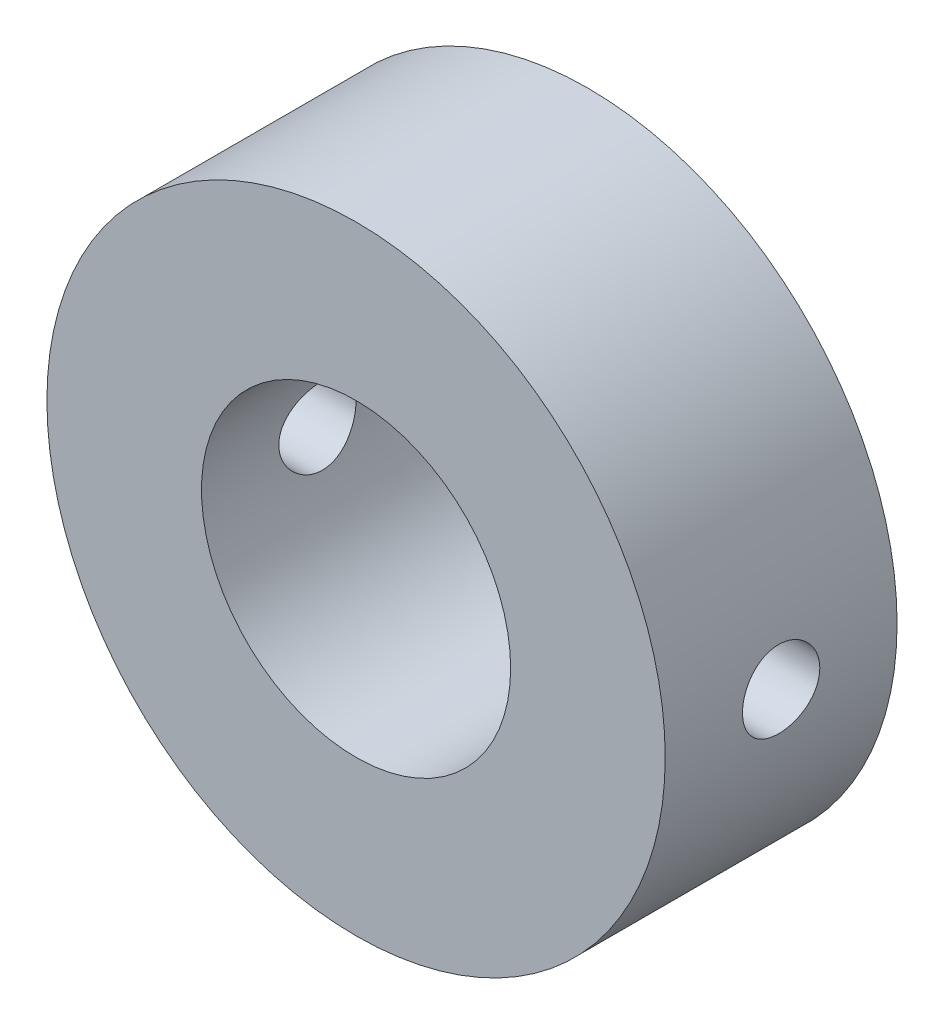
ISO-10303-21;
HEADER;
FILE_DESCRIPTION(('STEP AP214'),'2;1');
FILE_NAME('part.step','',(''),(''),'','','');
FILE_SCHEMA(('AUTOMOTIVE_DESIGN { 1 0 10303 214 1 1 1 1 }'));
ENDSEC;
DATA;
#1=APPLICATION_CONTEXT('core data for automotive mechanical design processes');
#2=APPLICATION_PROTOCOL_DEFINITION('international standard','automotive_design',2000,#1);
#3=PRODUCT_CONTEXT('',#1,'mechanical');
#4=PRODUCT('Part','Part','',(#3));
#5=PRODUCT_RELATED_PRODUCT_CATEGORY('part','',(#4));
#6=PRODUCT_DEFINITION_FORMATION('','',#4);
#7=PRODUCT_DEFINITION_CONTEXT('part definition',#1,'design');
#8=PRODUCT_DEFINITION('design','',#6,#7);
#9=PRODUCT_DEFINITION_SHAPE('','',#8);
#10=(LENGTH_UNIT() NAMED_UNIT(*) SI_UNIT(.MILLI.,.METRE.));
#11=(NAMED_UNIT(*) PLANE_ANGLE_UNIT() SI_UNIT($,.RADIAN.));
#12=(NAMED_UNIT(*) SI_UNIT($,.STERADIAN.) SOLID_ANGLE_UNIT());
#13=UNCERTAINTY_MEASURE_WITH_UNIT(LENGTH_MEASURE(1.E-05),#10,'distance_accuracy_value','');
#14=(GEOMETRIC_REPRESENTATION_CONTEXT(3) GLOBAL_UNCERTAINTY_ASSIGNED_CONTEXT((#13)) GLOBAL_UNIT_ASSIGNED_CONTEXT((#10,
#11,#12)) REPRESENTATION_CONTEXT('',''));
#15=CARTESIAN_POINT('',(0.,0.,0.));
#16=DIRECTION('',(0.,0.,1.));
#17=DIRECTION('',(1.,0.,0.));
#18=AXIS2_PLACEMENT_3D('',#15,#16,#17);
#19=CARTESIAN_POINT('',(0.,0.,6.));
#20=DIRECTION('',(0.,0.,1.));
#21=DIRECTION('',(1.,0.,0.));
#22=AXIS2_PLACEMENT_3D('',#19,#20,#21);
#23=PLANE('',#22);
#24=CARTESIAN_POINT('',(0.,0.,6.));
#25=DIRECTION('',(0.,0.,1.));
#26=DIRECTION('',(1.,0.,0.));
#27=AXIS2_PLACEMENT_3D('',#24,#25,#26);
#28=CIRCLE('',#27,8.);
#29=CARTESIAN_POINT('',(8.,0.,6.));
#30=VERTEX_POINT('',#29);
#31=EDGE_CURVE('E59',#30,#30,#28,.T.);
#32=ORIENTED_EDGE('',*,*,#31,.T.);
#33=EDGE_LOOP('',(#32));
#34=FACE_BOUND('',#33,.T.);
#35=CARTESIAN_POINT('',(0.,0.,6.));
#36=DIRECTION('',(0.,0.,1.));
#37=DIRECTION('',(1.,0.,0.));
#38=AXIS2_PLACEMENT_3D('',#35,#36,#37);
#39=CIRCLE('',#38,4.);
#40=CARTESIAN_POINT('',(4.,0.,6.));
#41=VERTEX_POINT('',#40);
#42=EDGE_CURVE('E95',#41,#41,#39,.T.);
#43=ORIENTED_EDGE('',*,*,#42,.F.);
#44=EDGE_LOOP('',(#43));
#45=FACE_BOUND('',#44,.T.);
#46=ADVANCED_FACE('F43',(#34,#45),#23,.T.);
#47=CARTESIAN_POINT('',(0.,0.,0.));
#48=DIRECTION('',(0.,0.,1.));
#49=DIRECTION('',(1.,0.,0.));
#50=AXIS2_PLACEMENT_3D('',#47,#48,#49);
#51=PLANE('',#50);
#52=CARTESIAN_POINT('',(0.,0.,0.));
#53=DIRECTION('',(0.,0.,1.));
#54=DIRECTION('',(1.,0.,0.));
#55=AXIS2_PLACEMENT_3D('',#52,#53,#54);
#56=CIRCLE('',#55,8.);
#57=CARTESIAN_POINT('',(8.,0.,0.));
#58=VERTEX_POINT('',#57);
#59=EDGE_CURVE('E63',#58,#58,#56,.T.);
#60=ORIENTED_EDGE('',*,*,#59,.F.);
#61=EDGE_LOOP('',(#60));
#62=FACE_BOUND('',#61,.T.);
#63=CARTESIAN_POINT('',(0.,0.,0.));
#64=DIRECTION('',(0.,0.,1.));
#65=DIRECTION('',(1.,0.,0.));
#66=AXIS2_PLACEMENT_3D('',#63,#64,#65);
#67=CIRCLE('',#66,4.);
#68=CARTESIAN_POINT('',(4.,0.,0.));
#69=VERTEX_POINT('',#68);
#70=EDGE_CURVE('E94',#69,#69,#67,.T.);
#71=ORIENTED_EDGE('',*,*,#70,.T.);
#72=EDGE_LOOP('',(#71));
#73=FACE_BOUND('',#72,.T.);
#74=ADVANCED_FACE('F101',(#62,#73),#51,.F.);
#75=CARTESIAN_POINT('',(0.,0.,6.));
#76=DIRECTION('',(0.,0.,-1.));
#77=DIRECTION('',(-1.,0.,0.));
#78=AXIS2_PLACEMENT_3D('',#75,#76,#77);
#79=CYLINDRICAL_SURFACE('',#78,8.);
#80=CARTESIAN_POINT('',(-8.,0.,2.00000000000001));
#81=CARTESIAN_POINT('',(-7.99999921958571,0.0559364382223041,2.00000237637429));
#82=CARTESIAN_POINT('',(-7.99940713821961,0.111907829721098,2.00470915166772));
#83=CARTESIAN_POINT('',(-7.99710216044544,0.222293120835899,2.02341110182833));
#84=CARTESIAN_POINT('',(-7.99538809376571,0.276705332249496,2.03741597516936));
#85=CARTESIAN_POINT('',(-7.99103224417762,0.382358229925219,2.07429505756564));
#86=CARTESIAN_POINT('',(-7.98839108582217,0.433601024058452,2.09716329672395));
#87=CARTESIAN_POINT('',(-7.98247480351239,0.53151178995721,2.15110691358792));
#88=CARTESIAN_POINT('',(-7.97919978833646,0.578180544622544,2.18218088341229));
#89=CARTESIAN_POINT('',(-7.9723612852253,0.665885126772522,2.25183677993584));
#90=CARTESIAN_POINT('',(-7.96879645876967,0.706892145974845,2.2904548517385));
#91=CARTESIAN_POINT('',(-7.961790904039,0.781861117422991,2.37402512941466));
#92=CARTESIAN_POINT('',(-7.95835018209707,0.815822710556894,2.4189776579653));
#93=CARTESIAN_POINT('',(-7.95196922247834,0.875844064513569,2.51412799102627));
#94=CARTESIAN_POINT('',(-7.94903070871165,0.901876838376422,2.56434294462718));
#95=CARTESIAN_POINT('',(-7.94400451383073,0.945129230630039,2.66847482077895));
#96=CARTESIAN_POINT('',(-7.94191680045255,0.962349183226079,2.72239160285881));
#97=CARTESIAN_POINT('',(-7.93884135841446,0.987399592009898,2.83209767823471));
#98=CARTESIAN_POINT('',(-7.93784793374698,0.995278685892673,2.88787570308168));
#99=CARTESIAN_POINT('',(-7.93705611257117,1.00157421982288,2.99997050538873));
#100=CARTESIAN_POINT('',(-7.93725766800603,0.999991040400959,3.05628726109252));
#101=CARTESIAN_POINT('',(-7.93882782147901,0.987446894579154,3.16752193089951));
#102=CARTESIAN_POINT('',(-7.94018975184131,0.976539505193871,3.2224459944801));
#103=CARTESIAN_POINT('',(-7.94391679903052,0.945740153272813,3.32967800848759));
#104=CARTESIAN_POINT('',(-7.94628193618289,0.925848008700754,3.38198590588561));
#105=CARTESIAN_POINT('',(-7.95175646345861,0.877586223964653,3.48266719960867));
#106=CARTESIAN_POINT('',(-7.95486789284578,0.849193301483048,3.53102932009959));
#107=CARTESIAN_POINT('',(-7.96148284572239,0.784752587782762,3.62232267776529));
#108=CARTESIAN_POINT('',(-7.96498638714265,0.748704446432305,3.66525366638947));
#109=CARTESIAN_POINT('',(-7.9720204395617,0.669679644301507,3.74477708428909));
#110=CARTESIAN_POINT('',(-7.97555096954756,0.626656803136,3.78132363670639));
#111=CARTESIAN_POINT('',(-7.98221853022341,0.535062867645565,3.84668355201221));
#112=CARTESIAN_POINT('',(-7.98535556000602,0.486491760527297,3.87549689706879));
#113=CARTESIAN_POINT('',(-7.99088460887432,0.385144668545389,3.92457252818556));
#114=CARTESIAN_POINT('',(-7.99327637760615,0.332367278135084,3.94483194155248));
#115=CARTESIAN_POINT('',(-7.99704314312025,0.22412317617242,3.97618819740929));
#116=CARTESIAN_POINT('',(-7.99841818750348,0.168656590652265,3.98728546885481));
#117=CARTESIAN_POINT('',(-7.99999038564304,0.0570052655653979,3.99994296970421));
#118=CARTESIAN_POINT('',(-8.00019534457054,0.000827796079442232,4.00156639694562));
#119=CARTESIAN_POINT('',(-7.99942535202172,-0.110998414598998,3.99539690637761));
#120=CARTESIAN_POINT('',(-7.99845042567285,-0.166647167025882,3.98760418909935));
#121=CARTESIAN_POINT('',(-7.99543507502677,-0.275649803088607,3.96287611649024));
#122=CARTESIAN_POINT('',(-7.99339816325548,-0.329010628169879,3.94597089463894));
#123=CARTESIAN_POINT('',(-7.98848689240079,-0.432139861943359,3.90352901923483));
#124=CARTESIAN_POINT('',(-7.98561250488249,-0.481908148586122,3.87799207260342));
#125=CARTESIAN_POINT('',(-7.97932729164045,-0.576721808274966,3.81885874499701));
#126=CARTESIAN_POINT('',(-7.97591377617004,-0.621741503977523,3.78522148407774));
#127=CARTESIAN_POINT('',(-7.96894056930262,-0.705518795850522,3.71090020098631));
#128=CARTESIAN_POINT('',(-7.96538087210759,-0.744276143334738,3.6702158990996));
#129=CARTESIAN_POINT('',(-7.95849242185034,-0.8146527835272,3.58267703329714));
#130=CARTESIAN_POINT('',(-7.95516509888531,-0.846230184227166,3.53578866147584));
#131=CARTESIAN_POINT('',(-7.94914164414859,-0.901061155777395,3.43733670205811));
#132=CARTESIAN_POINT('',(-7.94644549972411,-0.92431489349134,3.38577320820939));
#133=CARTESIAN_POINT('',(-7.94199940157198,-0.961770631546609,3.27956987234095));
#134=CARTESIAN_POINT('',(-7.94024698073915,-0.975996250982836,3.22493846798081));
#135=CARTESIAN_POINT('',(-7.93787966362982,-0.995067997547131,3.11403900648773));
#136=CARTESIAN_POINT('',(-7.93726471443511,-0.999914561014297,3.0577710256164));
#137=CARTESIAN_POINT('',(-7.93724350792982,-1.00008261443393,2.94561242831813));
#138=CARTESIAN_POINT('',(-7.93782889900781,-0.995469919079702,2.88972190066725));
#139=CARTESIAN_POINT('',(-7.94012445814881,-0.976989761939723,2.77951714826197));
#140=CARTESIAN_POINT('',(-7.94183462633232,-0.9631222991623,2.72520292367648));
#141=CARTESIAN_POINT('',(-7.9461844630982,-0.926546829475855,2.61970121729344));
#142=CARTESIAN_POINT('',(-7.94882379837114,-0.903841992388366,2.56851262199128));
#143=CARTESIAN_POINT('',(-7.95473513297928,-0.850242760860117,2.47066133838068));
#144=CARTESIAN_POINT('',(-7.95800714024165,-0.819348263803829,2.42399870679207));
#145=CARTESIAN_POINT('',(-7.96484241900893,-0.750002532506329,2.33618750986382));
#146=CARTESIAN_POINT('',(-7.96840748833613,-0.711502250309977,2.29507781561801));
#147=CARTESIAN_POINT('',(-7.9754113263716,-0.628140090787348,2.21987726993282));
#148=CARTESIAN_POINT('',(-7.97885006510236,-0.583276715656622,2.18578807569028));
#149=CARTESIAN_POINT('',(-7.98522822634699,-0.48826624834168,2.12548585715789));
#150=CARTESIAN_POINT('',(-7.98816570031321,-0.438099711838464,2.09930327764031));
#151=CARTESIAN_POINT('',(-7.9931905963069,-0.33407316092051,2.0557715028335));
#152=CARTESIAN_POINT('',(-7.9952789414783,-0.280217232348092,2.03841270945862));
#153=CARTESIAN_POINT('',(-7.99786688131098,-0.188402308787168,2.01717626473149));
#154=CARTESIAN_POINT('',(-7.99866290358181,-0.151022265406767,2.01074442320718));
#155=CARTESIAN_POINT('',(-7.99972972531675,-0.0757668252849733,2.00215550172272));
#156=CARTESIAN_POINT('',(-8.00000052865388,-0.0378914321984106,1.99999839024029));
#157=CARTESIAN_POINT('',(-8.,0.,2.00000000000001));
#158=B_SPLINE_CURVE_WITH_KNOTS('',3,(#80,#81,#82,#83,#84,#85,#86,#87,#88,#89,#90,#91,#92,#93,
#94,#95,#96,#97,#98,#99,#100,#101,#102,#103,#104,#105,#106,#107,#108,#109,#110,#111,#112,#113,
#114,#115,#116,#117,#118,#119,#120,#121,#122,#123,#124,#125,#126,#127,#128,#129,#130,#131,#132,
#133,#134,#135,#136,#137,#138,#139,#140,#141,#142,#143,#144,#145,#146,#147,#148,#149,#150,#151,
#152,#153,#154,#155,#156,#157),.UNSPECIFIED.,.T.,.F.,(4,2,2,2,2,2,2,2,2,2,2,2,2,2,2,2,2,2,2,2,2,
2,2,2,2,2,2,2,2,2,2,2,2,2,2,2,2,2,4),(0.,0.167670909110498,0.335516984377368,0.503250203272704,
0.670954662364288,0.839483252807366,1.00802043120003,1.17712500127547,1.34622315798722,
1.51443690114527,1.68264387953864,1.84989078576675,2.01714108066495,2.18485370514212,
2.35257400205454,2.52145391254565,2.69033421245243,2.8592711829264,3.0282002436151,
3.19600111756766,3.36379841800769,3.53104421557355,3.69829569231576,3.86640961171366,
4.03453020550032,4.20360788603026,4.37268217688612,4.54131229712366,4.70993457204245,
4.87738760480882,5.04484065551815,5.21223369882591,5.37962883964901,5.54814095076728,
5.71669279388001,5.88588561214737,6.05489399473608,6.16847537275046,6.2820559132017),.UNSPECIFIED.);
#159=CARTESIAN_POINT('',(-8.,0.,2.00000000000001));
#160=VERTEX_POINT('',#159);
#161=EDGE_CURVE('E11',#160,#160,#158,.T.);
#162=ORIENTED_EDGE('',*,*,#161,.T.);
#163=EDGE_LOOP('',(#162));
#164=FACE_BOUND('',#163,.T.);
#165=CARTESIAN_POINT('',(8.,0.,2.00000000000001));
#166=CARTESIAN_POINT('',(7.99999921958571,-0.0559364382223041,2.00000237637429));
#167=CARTESIAN_POINT('',(7.99940713821961,-0.111907829721098,2.00470915166772));
#168=CARTESIAN_POINT('',(7.99710216044544,-0.222293120835899,2.02341110182833));
#169=CARTESIAN_POINT('',(7.99538809376571,-0.276705332249496,2.03741597516936));
#170=CARTESIAN_POINT('',(7.99103224417762,-0.382358229925219,2.07429505756564));
#171=CARTESIAN_POINT('',(7.98839108582217,-0.433601024058452,2.09716329672395));
#172=CARTESIAN_POINT('',(7.98247480351239,-0.53151178995721,2.15110691358792));
#173=CARTESIAN_POINT('',(7.97919978833646,-0.578180544622544,2.18218088341229));
#174=CARTESIAN_POINT('',(7.9723612852253,-0.665885126772522,2.25183677993584));
#175=CARTESIAN_POINT('',(7.96879645876967,-0.706892145974845,2.2904548517385));
#176=CARTESIAN_POINT('',(7.961790904039,-0.781861117422991,2.37402512941466));
#177=CARTESIAN_POINT('',(7.95835018209707,-0.815822710556894,2.4189776579653));
#178=CARTESIAN_POINT('',(7.95196922247834,-0.875844064513569,2.51412799102627));
#179=CARTESIAN_POINT('',(7.94903070871165,-0.901876838376422,2.56434294462718));
#180=CARTESIAN_POINT('',(7.94400451383073,-0.945129230630039,2.66847482077895));
#181=CARTESIAN_POINT('',(7.94191680045255,-0.962349183226079,2.72239160285881));
#182=CARTESIAN_POINT('',(7.93884135841446,-0.987399592009898,2.83209767823471));
#183=CARTESIAN_POINT('',(7.93784793374698,-0.995278685892673,2.88787570308168));
#184=CARTESIAN_POINT('',(7.93705611257117,-1.00157421982288,2.99997050538873));
#185=CARTESIAN_POINT('',(7.93725766800603,-0.999991040400959,3.05628726109252));
#186=CARTESIAN_POINT('',(7.93882782147901,-0.987446894579154,3.16752193089951));
#187=CARTESIAN_POINT('',(7.94018975184131,-0.976539505193871,3.2224459944801));
#188=CARTESIAN_POINT('',(7.94391679903052,-0.945740153272813,3.32967800848759));
#189=CARTESIAN_POINT('',(7.94628193618289,-0.925848008700754,3.38198590588561));
#190=CARTESIAN_POINT('',(7.95175646345861,-0.877586223964653,3.48266719960867));
#191=CARTESIAN_POINT('',(7.95486789284578,-0.849193301483048,3.53102932009959));
#192=CARTESIAN_POINT('',(7.96148284572239,-0.784752587782762,3.62232267776529));
#193=CARTESIAN_POINT('',(7.96498638714265,-0.748704446432305,3.66525366638947));
#194=CARTESIAN_POINT('',(7.9720204395617,-0.669679644301507,3.74477708428909));
#195=CARTESIAN_POINT('',(7.97555096954756,-0.626656803136,3.78132363670639));
#196=CARTESIAN_POINT('',(7.98221853022341,-0.535062867645565,3.84668355201221));
#197=CARTESIAN_POINT('',(7.98535556000602,-0.486491760527297,3.87549689706879));
#198=CARTESIAN_POINT('',(7.99088460887432,-0.385144668545389,3.92457252818556));
#199=CARTESIAN_POINT('',(7.99327637760615,-0.332367278135084,3.94483194155248));
#200=CARTESIAN_POINT('',(7.99704314312025,-0.22412317617242,3.97618819740929));
#201=CARTESIAN_POINT('',(7.99841818750348,-0.168656590652265,3.98728546885481));
#202=CARTESIAN_POINT('',(7.99999038564304,-0.0570052655653979,3.99994296970421));
#203=CARTESIAN_POINT('',(8.00019534457054,-0.000827796079442232,4.00156639694562));
#204=CARTESIAN_POINT('',(7.99942535202172,0.110998414598998,3.99539690637761));
#205=CARTESIAN_POINT('',(7.99845042567285,0.166647167025882,3.98760418909935));
#206=CARTESIAN_POINT('',(7.99543507502677,0.275649803088607,3.96287611649024));
#207=CARTESIAN_POINT('',(7.99339816325548,0.329010628169879,3.94597089463894));
#208=CARTESIAN_POINT('',(7.98848689240079,0.432139861943359,3.90352901923483));
#209=CARTESIAN_POINT('',(7.98561250488249,0.481908148586122,3.87799207260342));
#210=CARTESIAN_POINT('',(7.97932729164045,0.576721808274966,3.81885874499701));
#211=CARTESIAN_POINT('',(7.97591377617004,0.621741503977523,3.78522148407774));
#212=CARTESIAN_POINT('',(7.96894056930262,0.705518795850522,3.71090020098631));
#213=CARTESIAN_POINT('',(7.96538087210759,0.744276143334738,3.6702158990996));
#214=CARTESIAN_POINT('',(7.95849242185034,0.8146527835272,3.58267703329714));
#215=CARTESIAN_POINT('',(7.95516509888531,0.846230184227166,3.53578866147584));
#216=CARTESIAN_POINT('',(7.94914164414859,0.901061155777395,3.43733670205811));
#217=CARTESIAN_POINT('',(7.94644549972411,0.92431489349134,3.38577320820939));
#218=CARTESIAN_POINT('',(7.94199940157198,0.961770631546609,3.27956987234095));
#219=CARTESIAN_POINT('',(7.94024698073915,0.975996250982836,3.22493846798081));
#220=CARTESIAN_POINT('',(7.93787966362982,0.995067997547131,3.11403900648773));
#221=CARTESIAN_POINT('',(7.93726471443511,0.999914561014297,3.0577710256164));
#222=CARTESIAN_POINT('',(7.93724350792982,1.00008261443393,2.94561242831813));
#223=CARTESIAN_POINT('',(7.93782889900781,0.995469919079702,2.88972190066725));
#224=CARTESIAN_POINT('',(7.94012445814881,0.976989761939723,2.77951714826197));
#225=CARTESIAN_POINT('',(7.94183462633232,0.9631222991623,2.72520292367648));
#226=CARTESIAN_POINT('',(7.9461844630982,0.926546829475855,2.61970121729344));
#227=CARTESIAN_POINT('',(7.94882379837114,0.903841992388366,2.56851262199128));
#228=CARTESIAN_POINT('',(7.95473513297928,0.850242760860117,2.47066133838068));
#229=CARTESIAN_POINT('',(7.95800714024165,0.819348263803829,2.42399870679207));
#230=CARTESIAN_POINT('',(7.96484241900893,0.750002532506329,2.33618750986382));
#231=CARTESIAN_POINT('',(7.96840748833613,0.711502250309977,2.29507781561801));
#232=CARTESIAN_POINT('',(7.9754113263716,0.628140090787348,2.21987726993282));
#233=CARTESIAN_POINT('',(7.97885006510236,0.583276715656622,2.18578807569028));
#234=CARTESIAN_POINT('',(7.98522822634699,0.48826624834168,2.12548585715789));
#235=CARTESIAN_POINT('',(7.98816570031321,0.438099711838464,2.09930327764031));
#236=CARTESIAN_POINT('',(7.9931905963069,0.33407316092051,2.0557715028335));
#237=CARTESIAN_POINT('',(7.9952789414783,0.280217232348092,2.03841270945862));
#238=CARTESIAN_POINT('',(7.99786688131098,0.188402308787168,2.01717626473149));
#239=CARTESIAN_POINT('',(7.99866290358181,0.151022265406767,2.01074442320718));
#240=CARTESIAN_POINT('',(7.99972972531675,0.0757668252849733,2.00215550172272));
#241=CARTESIAN_POINT('',(8.00000052865388,0.0378914321984106,1.99999839024029));
#242=CARTESIAN_POINT('',(8.,0.,2.00000000000001));
#243=B_SPLINE_CURVE_WITH_KNOTS('',3,(#165,#166,#167,#168,#169,#170,#171,#172,#173,#174,#175,
#176,#177,#178,#179,#180,#181,#182,#183,#184,#185,#186,#187,#188,#189,#190,#191,#192,#193,#194,
#195,#196,#197,#198,#199,#200,#201,#202,#203,#204,#205,#206,#207,#208,#209,#210,#211,#212,#213,
#214,#215,#216,#217,#218,#219,#220,#221,#222,#223,#224,#225,#226,#227,#228,#229,#230,#231,#232,
#233,#234,#235,#236,#237,#238,#239,#240,#241,#242),.UNSPECIFIED.,.T.,.F.,(4,2,2,2,2,2,2,2,2,2,2,
2,2,2,2,2,2,2,2,2,2,2,2,2,2,2,2,2,2,2,2,2,2,2,2,2,2,2,4),(0.,0.167670909110498,
0.335516984377368,0.503250203272704,0.670954662364288,0.839483252807366,1.00802043120003,
1.17712500127547,1.34622315798722,1.51443690114527,1.68264387953864,1.84989078576675,
2.01714108066495,2.18485370514212,2.35257400205454,2.52145391254565,2.69033421245243,
2.8592711829264,3.0282002436151,3.19600111756766,3.36379841800769,3.53104421557355,
3.69829569231576,3.86640961171366,4.03453020550032,4.20360788603026,4.37268217688612,
4.54131229712366,4.70993457204245,4.87738760480882,5.04484065551815,5.21223369882591,
5.37962883964901,5.54814095076728,5.71669279388001,5.88588561214737,6.05489399473608,
6.16847537275046,6.2820559132017),.UNSPECIFIED.);
#244=CARTESIAN_POINT('',(8.,0.,2.00000000000001));
#245=VERTEX_POINT('',#244);
#246=EDGE_CURVE('E55',#245,#245,#243,.T.);
#247=ORIENTED_EDGE('',*,*,#246,.T.);
#248=EDGE_LOOP('',(#247));
#249=FACE_BOUND('',#248,.T.);
#250=ORIENTED_EDGE('',*,*,#31,.F.);
#251=EDGE_LOOP('',(#250));
#252=FACE_BOUND('',#251,.T.);
#253=ORIENTED_EDGE('',*,*,#59,.T.);
#254=EDGE_LOOP('',(#253));
#255=FACE_BOUND('',#254,.T.);
#256=ADVANCED_FACE('F45',(#164,#249,#252,#255),#79,.T.);
#257=CARTESIAN_POINT('',(0.,0.,6.));
#258=DIRECTION('',(0.,0.,-1.));
#259=DIRECTION('',(-1.,0.,0.));
#260=AXIS2_PLACEMENT_3D('',#257,#258,#259);
#261=CYLINDRICAL_SURFACE('',#260,4.);
#262=CARTESIAN_POINT('',(-4.,0.,3.99999999999999));
#263=CARTESIAN_POINT('',(-3.99999906578675,-0.0552507257798203,3.99999844950789));
#264=CARTESIAN_POINT('',(-3.99884385421219,-0.110518771887175,3.99540563281747));
#265=CARTESIAN_POINT('',(-3.99434742553262,-0.219470882513687,3.97718323246199));
#266=CARTESIAN_POINT('',(-3.99100496946646,-0.273154031247157,3.96354852697476));
#267=CARTESIAN_POINT('',(-3.98250417554693,-0.377347248121715,3.9277071643586));
#268=CARTESIAN_POINT('',(-3.97734801894725,-0.427861042286665,3.90551080085647));
#269=CARTESIAN_POINT('',(-3.96576895871729,-0.52444808793628,3.85321240663677));
#270=CARTESIAN_POINT('',(-3.95934601236034,-0.570521189565835,3.82311010925404));
#271=CARTESIAN_POINT('',(-3.94578275727868,-0.657867951533941,3.75519947356385));
#272=CARTESIAN_POINT('',(-3.93863138099022,-0.699037126707376,3.71725895002721));
#273=CARTESIAN_POINT('',(-3.92449080078353,-0.774499284802197,3.63503186339405));
#274=CARTESIAN_POINT('',(-3.91750161525566,-0.808791491299417,3.59074458470233));
#275=CARTESIAN_POINT('',(-3.9043651713314,-0.870017695199348,3.49626984884171));
#276=CARTESIAN_POINT('',(-3.89823196313737,-0.896834810616897,3.44600451279306));
#277=CARTESIAN_POINT('',(-3.88766329874816,-0.941597939033678,3.34150105889442));
#278=CARTESIAN_POINT('',(-3.88322757115193,-0.959545370292881,3.28726357778282));
#279=CARTESIAN_POINT('',(-3.87666984478367,-0.985703224536186,3.17750433453168));
#280=CARTESIAN_POINT('',(-3.87450327383617,-0.994101512222218,3.12203006930013));
#281=CARTESIAN_POINT('',(-3.87259575025161,-1.00150785004523,3.01042095399068));
#282=CARTESIAN_POINT('',(-3.87285440299096,-1.00051742787864,2.95428621286759));
#283=CARTESIAN_POINT('',(-3.87572803664412,-0.989324349759513,2.84438946150368));
#284=CARTESIAN_POINT('',(-3.87828575334586,-0.979345560127005,2.79060291902327));
#285=CARTESIAN_POINT('',(-3.88537806450989,-0.950816124602064,2.68549263272581));
#286=CARTESIAN_POINT('',(-3.88991279980464,-0.932264868046275,2.63416906464735));
#287=CARTESIAN_POINT('',(-3.90050075936125,-0.886926318624762,2.53484132249863));
#288=CARTESIAN_POINT('',(-3.90656884979614,-0.860057778155267,2.48687588547364));
#289=CARTESIAN_POINT('',(-3.91953140564257,-0.798904184009963,2.39605419349545));
#290=CARTESIAN_POINT('',(-3.9264260155649,-0.76461783253922,2.35319883462183));
#291=CARTESIAN_POINT('',(-3.94050587026521,-0.688442283120806,2.27253092287041));
#292=CARTESIAN_POINT('',(-3.94769379651981,-0.646364172110568,2.23489700662577));
#293=CARTESIAN_POINT('',(-3.96137310385857,-0.556407945002462,2.1671858383574));
#294=CARTESIAN_POINT('',(-3.96786446366277,-0.508529651805291,2.13710881715763));
#295=CARTESIAN_POINT('',(-3.97945154729455,-0.408077259120924,2.08529960918375));
#296=CARTESIAN_POINT('',(-3.9845424008515,-0.355487595472412,2.06359643983039));
#297=CARTESIAN_POINT('',(-3.99271944660946,-0.247250672095253,2.02938846286029));
#298=CARTESIAN_POINT('',(-3.99580602226187,-0.191603999433654,2.01688189572125));
#299=CARTESIAN_POINT('',(-3.9995699951425,-0.0803599802600164,2.00169495629412));
#300=CARTESIAN_POINT('',(-4.00030702338852,-0.0247978133254721,1.99877131594981));
#301=CARTESIAN_POINT('',(-3.999458698763,0.0860219165343389,2.00216600137033));
#302=CARTESIAN_POINT('',(-3.99787355494564,0.14127950642973,2.00848349519943));
#303=CARTESIAN_POINT('',(-3.99259720751571,0.249076179184326,2.02998060559426));
#304=CARTESIAN_POINT('',(-3.98893756123874,0.301643412645835,2.04502750898467));
#305=CARTESIAN_POINT('',(-3.97992471089423,0.403504861635005,2.08340472268564));
#306=CARTESIAN_POINT('',(-3.97457133579928,0.452798746021753,2.10673586954212));
#307=CARTESIAN_POINT('',(-3.96262205284207,0.547682089619894,2.16149075258316));
#308=CARTESIAN_POINT('',(-3.95600578244622,0.593190294557216,2.19305074159785));
#309=CARTESIAN_POINT('',(-3.94229672791613,0.678351075762159,2.26319327253132));
#310=CARTESIAN_POINT('',(-3.93520386167803,0.718002639315333,2.30177702641128));
#311=CARTESIAN_POINT('',(-3.92112637973847,0.791327045381814,2.38600130722965));
#312=CARTESIAN_POINT('',(-3.91414869458187,0.824829245081349,2.43179180200162));
#313=CARTESIAN_POINT('',(-3.90128585584826,0.883673839341792,2.52848842297715));
#314=CARTESIAN_POINT('',(-3.89540065378017,0.909016596105284,2.57939432197317));
#315=CARTESIAN_POINT('',(-3.88545396489777,0.950634280406187,2.68460381494206));
#316=CARTESIAN_POINT('',(-3.88138170194604,0.966962931102703,2.73888508556268));
#317=CARTESIAN_POINT('',(-3.87551162726789,0.990230439969178,2.84953975859274));
#318=CARTESIAN_POINT('',(-3.87371331813291,0.99717135165243,2.90591270068833));
#319=CARTESIAN_POINT('',(-3.87263267469305,1.00135906022265,3.01741401590347));
#320=CARTESIAN_POINT('',(-3.87327955152176,0.998878598520071,3.07253162341649));
#321=CARTESIAN_POINT('',(-3.87685272671895,0.984918185541903,3.18153592577865));
#322=CARTESIAN_POINT('',(-3.87977897927905,0.973438415124505,3.23542264534243));
#323=CARTESIAN_POINT('',(-3.88754173788482,0.941954212961855,3.34013897271027));
#324=CARTESIAN_POINT('',(-3.89236676824206,0.922000936453576,3.39098487016014));
#325=CARTESIAN_POINT('',(-3.90338503816553,0.87417660907004,3.48864358847579));
#326=CARTESIAN_POINT('',(-3.90957846747182,0.846304460022785,3.53545584879127));
#327=CARTESIAN_POINT('',(-3.92283756175675,0.782578499091417,3.62503641933468));
#328=CARTESIAN_POINT('',(-3.92992176554505,0.746535441941496,3.66766738228264));
#329=CARTESIAN_POINT('',(-3.94405351497524,0.66785958079315,3.74636469653027));
#330=CARTESIAN_POINT('',(-3.95110105151373,0.625225214174091,3.78242948674197));
#331=CARTESIAN_POINT('',(-3.96451770431776,0.533645057801721,3.84760753904307));
#332=CARTESIAN_POINT('',(-3.97087222243912,0.484598948210919,3.87658307578105));
#333=CARTESIAN_POINT('',(-3.98203283316746,0.38217737300698,3.92583164196035));
#334=CARTESIAN_POINT('',(-3.98684003466521,0.328805042291156,3.94611090709902));
#335=CARTESIAN_POINT('',(-3.99365373043694,0.229606835495645,3.97438122021976));
#336=CARTESIAN_POINT('',(-3.9960172336846,0.184253447272044,3.98396749536895));
#337=CARTESIAN_POINT('',(-3.99919070154632,0.0926040476908549,3.99677729574795));
#338=CARTESIAN_POINT('',(-4.00000078300596,0.0463081074950772,4.00000129953686));
#339=CARTESIAN_POINT('',(-4.,0.,3.99999999999999));
#340=B_SPLINE_CURVE_WITH_KNOTS('',3,(#262,#263,#264,#265,#266,#267,#268,#269,#270,#271,#272,
#273,#274,#275,#276,#277,#278,#279,#280,#281,#282,#283,#284,#285,#286,#287,#288,#289,#290,#291,
#292,#293,#294,#295,#296,#297,#298,#299,#300,#301,#302,#303,#304,#305,#306,#307,#308,#309,#310,
#311,#312,#313,#314,#315,#316,#317,#318,#319,#320,#321,#322,#323,#324,#325,#326,#327,#328,#329,
#330,#331,#332,#333,#334,#335,#336,#337,#338,#339),.UNSPECIFIED.,.T.,.F.,(4,2,2,2,2,2,2,2,2,2,2,
2,2,2,2,2,2,2,2,2,2,2,2,2,2,2,2,2,2,2,2,2,2,2,2,2,2,2,4),(0.,0.165582474981259,0.33125882517593,
0.496736601524067,0.66221996011288,0.830762902914253,0.999324863867071,1.1703909836387,
1.34142974112911,1.50904196732952,1.6766269207513,1.84014998004677,2.00368468977357,
2.16887018582584,2.3340846055744,2.50401000646011,2.67394059705496,2.84445486006074,
3.0149364912576,3.18105539299515,3.34715934075159,3.51080183009355,3.67446084881524,
3.84102391710232,4.00761575338676,4.17829672802981,4.34897012499669,4.51861503076021,
4.68822282168268,4.85295853599071,5.01769093970686,5.18144267039627,5.34521712091263,
5.51326384273269,5.68135046513607,5.85248123666387,6.02348909214229,6.16228161961428,
6.30106370695355),.UNSPECIFIED.);
#341=CARTESIAN_POINT('',(-4.,0.,3.99999999999999));
#342=VERTEX_POINT('',#341);
#343=EDGE_CURVE('E88',#342,#342,#340,.T.);
#344=ORIENTED_EDGE('',*,*,#343,.F.);
#345=EDGE_LOOP('',(#344));
#346=FACE_BOUND('',#345,.T.);
#347=CARTESIAN_POINT('',(4.,0.,2.00000000000001));
#348=CARTESIAN_POINT('',(3.99999906578675,-0.0552507257798203,2.00000155049211));
#349=CARTESIAN_POINT('',(3.99884385421219,-0.110518771887175,2.00459436718253));
#350=CARTESIAN_POINT('',(3.99434742553262,-0.219470882513687,2.02281676753801));
#351=CARTESIAN_POINT('',(3.99100496946646,-0.273154031247157,2.03645147302524));
#352=CARTESIAN_POINT('',(3.98250417554693,-0.377347248121715,2.0722928356414));
#353=CARTESIAN_POINT('',(3.97734801894725,-0.427861042286665,2.09448919914353));
#354=CARTESIAN_POINT('',(3.96576895871729,-0.52444808793628,2.14678759336323));
#355=CARTESIAN_POINT('',(3.95934601236034,-0.570521189565835,2.17688989074596));
#356=CARTESIAN_POINT('',(3.94578275727868,-0.657867951533941,2.24480052643615));
#357=CARTESIAN_POINT('',(3.93863138099022,-0.699037126707376,2.28274104997279));
#358=CARTESIAN_POINT('',(3.92449080078353,-0.774499284802197,2.36496813660595));
#359=CARTESIAN_POINT('',(3.91750161525566,-0.808791491299417,2.40925541529767));
#360=CARTESIAN_POINT('',(3.9043651713314,-0.870017695199348,2.5037301511583));
#361=CARTESIAN_POINT('',(3.89823196313737,-0.896834810616897,2.55399548720694));
#362=CARTESIAN_POINT('',(3.88766329874816,-0.941597939033678,2.65849894110558));
#363=CARTESIAN_POINT('',(3.88322757115193,-0.959545370292881,2.71273642221718));
#364=CARTESIAN_POINT('',(3.87666984478367,-0.985703224536186,2.82249566546832));
#365=CARTESIAN_POINT('',(3.87450327383617,-0.994101512222218,2.87796993069987));
#366=CARTESIAN_POINT('',(3.87259575025161,-1.00150785004523,2.98957904600932));
#367=CARTESIAN_POINT('',(3.87285440299096,-1.00051742787864,3.04571378713241));
#368=CARTESIAN_POINT('',(3.87572803664412,-0.989324349759513,3.15561053849632));
#369=CARTESIAN_POINT('',(3.87828575334586,-0.979345560127005,3.20939708097673));
#370=CARTESIAN_POINT('',(3.88537806450989,-0.950816124602064,3.31450736727419));
#371=CARTESIAN_POINT('',(3.88991279980464,-0.932264868046275,3.36583093535265));
#372=CARTESIAN_POINT('',(3.90050075936125,-0.886926318624762,3.46515867750137));
#373=CARTESIAN_POINT('',(3.90656884979614,-0.860057778155267,3.51312411452636));
#374=CARTESIAN_POINT('',(3.91953140564257,-0.798904184009963,3.60394580650455));
#375=CARTESIAN_POINT('',(3.9264260155649,-0.76461783253922,3.64680116537817));
#376=CARTESIAN_POINT('',(3.94050587026521,-0.688442283120806,3.72746907712959));
#377=CARTESIAN_POINT('',(3.94769379651981,-0.646364172110568,3.76510299337423));
#378=CARTESIAN_POINT('',(3.96137310385857,-0.556407945002462,3.8328141616426));
#379=CARTESIAN_POINT('',(3.96786446366277,-0.508529651805291,3.86289118284237));
#380=CARTESIAN_POINT('',(3.97945154729455,-0.408077259120924,3.91470039081625));
#381=CARTESIAN_POINT('',(3.9845424008515,-0.355487595472412,3.93640356016961));
#382=CARTESIAN_POINT('',(3.99271944660946,-0.247250672095253,3.97061153713971));
#383=CARTESIAN_POINT('',(3.99580602226187,-0.191603999433655,3.98311810427875));
#384=CARTESIAN_POINT('',(3.9995699951425,-0.0803599802600168,3.99830504370588));
#385=CARTESIAN_POINT('',(4.00030702338852,-0.0247978133254725,4.00122868405019));
#386=CARTESIAN_POINT('',(3.999458698763,0.0860219165343385,3.99783399862967));
#387=CARTESIAN_POINT('',(3.99787355494564,0.141279506429729,3.99151650480057));
#388=CARTESIAN_POINT('',(3.99259720751571,0.249076179184327,3.97001939440574));
#389=CARTESIAN_POINT('',(3.98893756123874,0.301643412645835,3.95497249101533));
#390=CARTESIAN_POINT('',(3.97992471089423,0.403504861635005,3.91659527731436));
#391=CARTESIAN_POINT('',(3.97457133579928,0.452798746021754,3.89326413045788));
#392=CARTESIAN_POINT('',(3.96262205284207,0.547682089619894,3.83850924741684));
#393=CARTESIAN_POINT('',(3.95600578244622,0.593190294557216,3.80694925840215));
#394=CARTESIAN_POINT('',(3.94229672791613,0.678351075762159,3.73680672746868));
#395=CARTESIAN_POINT('',(3.93520386167803,0.718002639315333,3.69822297358872));
#396=CARTESIAN_POINT('',(3.92112637973847,0.791327045381814,3.61399869277035));
#397=CARTESIAN_POINT('',(3.91414869458187,0.824829245081348,3.56820819799838));
#398=CARTESIAN_POINT('',(3.90128585584826,0.883673839341792,3.47151157702285));
#399=CARTESIAN_POINT('',(3.89540065378018,0.909016596105284,3.42060567802683));
#400=CARTESIAN_POINT('',(3.88545396489777,0.950634280406187,3.31539618505795));
#401=CARTESIAN_POINT('',(3.88138170194604,0.966962931102703,3.26111491443732));
#402=CARTESIAN_POINT('',(3.87551162726789,0.990230439969178,3.15046024140726));
#403=CARTESIAN_POINT('',(3.87371331813291,0.99717135165243,3.09408729931167));
#404=CARTESIAN_POINT('',(3.87263267469305,1.00135906022265,2.98258598409653));
#405=CARTESIAN_POINT('',(3.87327955152176,0.998878598520071,2.92746837658351));
#406=CARTESIAN_POINT('',(3.87685272671895,0.984918185541903,2.81846407422135));
#407=CARTESIAN_POINT('',(3.87977897927905,0.973438415124505,2.76457735465757));
#408=CARTESIAN_POINT('',(3.88754173788482,0.941954212961855,2.65986102728973));
#409=CARTESIAN_POINT('',(3.89236676824206,0.922000936453576,2.60901512983986));
#410=CARTESIAN_POINT('',(3.90338503816553,0.87417660907004,2.51135641152421));
#411=CARTESIAN_POINT('',(3.90957846747182,0.846304460022785,2.46454415120873));
#412=CARTESIAN_POINT('',(3.92283756175675,0.782578499091417,2.37496358066532));
#413=CARTESIAN_POINT('',(3.92992176554505,0.746535441941497,2.33233261771737));
#414=CARTESIAN_POINT('',(3.94405351497524,0.667859580793151,2.25363530346973));
#415=CARTESIAN_POINT('',(3.95110105151373,0.625225214174091,2.21757051325803));
#416=CARTESIAN_POINT('',(3.96451770431775,0.533645057801722,2.15239246095693));
#417=CARTESIAN_POINT('',(3.97087222243912,0.484598948210919,2.12341692421895));
#418=CARTESIAN_POINT('',(3.98203283316746,0.38217737300698,2.07416835803965));
#419=CARTESIAN_POINT('',(3.98684003466521,0.328805042291156,2.05388909290098));
#420=CARTESIAN_POINT('',(3.99365373043694,0.229606835495645,2.02561877978024));
#421=CARTESIAN_POINT('',(3.9960172336846,0.184253447272043,2.01603250463105));
#422=CARTESIAN_POINT('',(3.99919070154632,0.0926040476908541,2.00322270425205));
#423=CARTESIAN_POINT('',(4.00000078300596,0.0463081074950769,1.99999870046314));
#424=CARTESIAN_POINT('',(4.,0.,2.00000000000001));
#425=B_SPLINE_CURVE_WITH_KNOTS('',3,(#347,#348,#349,#350,#351,#352,#353,#354,#355,#356,#357,
#358,#359,#360,#361,#362,#363,#364,#365,#366,#367,#368,#369,#370,#371,#372,#373,#374,#375,#376,
#377,#378,#379,#380,#381,#382,#383,#384,#385,#386,#387,#388,#389,#390,#391,#392,#393,#394,#395,
#396,#397,#398,#399,#400,#401,#402,#403,#404,#405,#406,#407,#408,#409,#410,#411,#412,#413,#414,
#415,#416,#417,#418,#419,#420,#421,#422,#423,#424),.UNSPECIFIED.,.T.,.F.,(4,2,2,2,2,2,2,2,2,2,2,
2,2,2,2,2,2,2,2,2,2,2,2,2,2,2,2,2,2,2,2,2,2,2,2,2,2,2,4),(0.,0.165582474981259,0.33125882517593,
0.496736601524067,0.66221996011288,0.830762902914253,0.999324863867071,1.1703909836387,
1.34142974112911,1.50904196732952,1.6766269207513,1.84014998004677,2.00368468977357,
2.16887018582584,2.3340846055744,2.50401000646011,2.67394059705496,2.84445486006074,
3.01493649125759,3.18105539299515,3.34715934075159,3.51080183009356,3.67446084881524,
3.84102391710232,4.00761575338676,4.17829672802981,4.34897012499669,4.51861503076021,
4.68822282168268,4.85295853599071,5.01769093970686,5.18144267039627,5.34521712091263,
5.51326384273269,5.68135046513607,5.85248123666387,6.02348909214229,6.16228161961428,
6.30106370695355),.UNSPECIFIED.);
#426=CARTESIAN_POINT('',(4.,0.,2.00000000000001));
#427=VERTEX_POINT('',#426);
#428=EDGE_CURVE('E83',#427,#427,#425,.T.);
#429=ORIENTED_EDGE('',*,*,#428,.F.);
#430=EDGE_LOOP('',(#429));
#431=FACE_BOUND('',#430,.T.);
#432=ORIENTED_EDGE('',*,*,#42,.T.);
#433=EDGE_LOOP('',(#432));
#434=FACE_BOUND('',#433,.T.);
#435=ORIENTED_EDGE('',*,*,#70,.F.);
#436=EDGE_LOOP('',(#435));
#437=FACE_BOUND('',#436,.T.);
#438=ADVANCED_FACE('F75',(#346,#431,#434,#437),#261,.F.);
#439=CARTESIAN_POINT('',(8.,0.,3.));
#440=DIRECTION('',(1.,0.,0.));
#441=DIRECTION('',(0.,0.,-1.));
#442=AXIS2_PLACEMENT_3D('',#439,#440,#441);
#443=CYLINDRICAL_SURFACE('',#442,0.999999999999992);
#444=ORIENTED_EDGE('',*,*,#428,.T.);
#445=EDGE_LOOP('',(#444));
#446=FACE_BOUND('',#445,.T.);
#447=ORIENTED_EDGE('',*,*,#246,.F.);
#448=EDGE_LOOP('',(#447));
#449=FACE_BOUND('',#448,.T.);
#450=ADVANCED_FACE('F73',(#446,#449),#443,.F.);
#451=ORIENTED_EDGE('',*,*,#343,.T.);
#452=EDGE_LOOP('',(#451));
#453=FACE_BOUND('',#452,.T.);
#454=ORIENTED_EDGE('',*,*,#161,.F.);
#455=EDGE_LOOP('',(#454));
#456=FACE_BOUND('',#455,.T.);
#457=ADVANCED_FACE('F69',(#453,#456),#443,.F.);
#458=CLOSED_SHELL('',(#46,#74,#256,#438,#450,#457));
#459=MANIFOLD_SOLID_BREP('B2',#458);
#460=ADVANCED_BREP_SHAPE_REPRESENTATION('',(#18,#459),#14);
#461=SHAPE_DEFINITION_REPRESENTATION(#9,#460);
ENDSEC;
END-ISO-10303-21;
